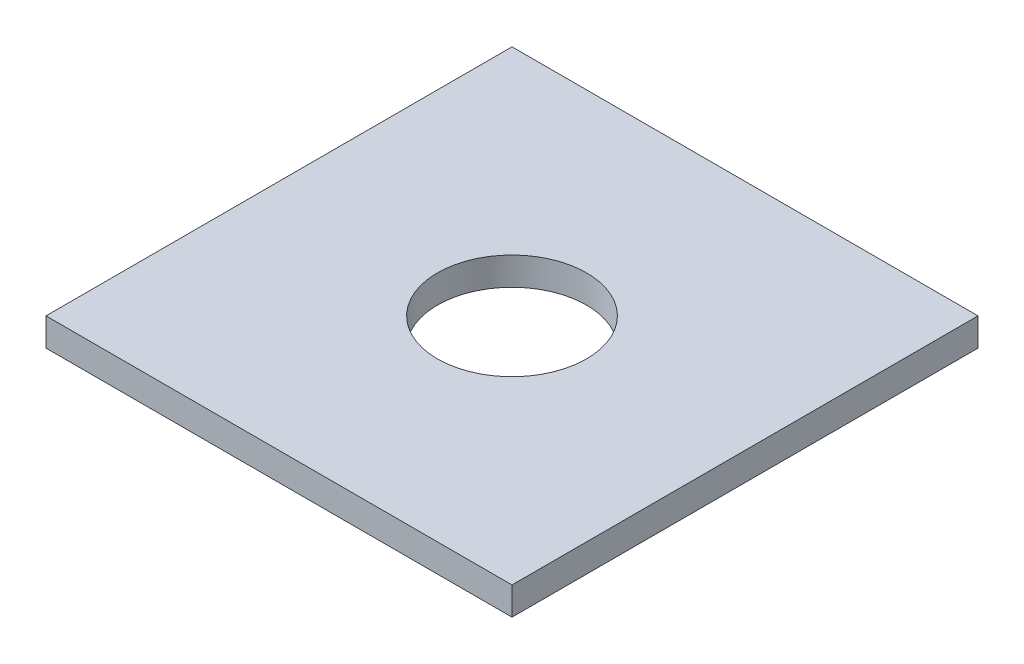
ISO-10303-21;
HEADER;
FILE_DESCRIPTION(('STEP AP214'),'2;1');
FILE_NAME('part.step','',(''),(''),'','','');
FILE_SCHEMA(('AUTOMOTIVE_DESIGN { 1 0 10303 214 1 1 1 1 }'));
ENDSEC;
DATA;
#1=APPLICATION_CONTEXT('core data for automotive mechanical design processes');
#2=APPLICATION_PROTOCOL_DEFINITION('international standard','automotive_design',2000,#1);
#3=PRODUCT_CONTEXT('',#1,'mechanical');
#4=PRODUCT('Part','Part','',(#3));
#5=PRODUCT_RELATED_PRODUCT_CATEGORY('part','',(#4));
#6=PRODUCT_DEFINITION_FORMATION('','',#4);
#7=PRODUCT_DEFINITION_CONTEXT('part definition',#1,'design');
#8=PRODUCT_DEFINITION('design','',#6,#7);
#9=PRODUCT_DEFINITION_SHAPE('','',#8);
#10=(LENGTH_UNIT() NAMED_UNIT(*) SI_UNIT(.MILLI.,.METRE.));
#11=(NAMED_UNIT(*) PLANE_ANGLE_UNIT() SI_UNIT($,.RADIAN.));
#12=(NAMED_UNIT(*) SI_UNIT($,.STERADIAN.) SOLID_ANGLE_UNIT());
#13=UNCERTAINTY_MEASURE_WITH_UNIT(LENGTH_MEASURE(1.E-05),#10,'distance_accuracy_value','');
#14=(GEOMETRIC_REPRESENTATION_CONTEXT(3) GLOBAL_UNCERTAINTY_ASSIGNED_CONTEXT((#13)) GLOBAL_UNIT_ASSIGNED_CONTEXT((#10,
#11,#12)) REPRESENTATION_CONTEXT('',''));
#15=CARTESIAN_POINT('',(0.,0.,0.));
#16=DIRECTION('',(0.,0.,1.));
#17=DIRECTION('',(1.,0.,0.));
#18=AXIS2_PLACEMENT_3D('',#15,#16,#17);
#19=CARTESIAN_POINT('',(0.,3.,0.));
#20=DIRECTION('',(0.,1.,0.));
#21=DIRECTION('',(0.,0.,1.));
#22=AXIS2_PLACEMENT_3D('',#19,#20,#21);
#23=PLANE('',#22);
#24=DIRECTION('',(0.,0.,-1.));
#25=VECTOR('',#24,1.);
#26=CARTESIAN_POINT('',(25.,3.,-25.));
#27=LINE('',#26,#25);
#28=CARTESIAN_POINT('',(25.,3.,25.));
#29=VERTEX_POINT('',#28);
#30=CARTESIAN_POINT('',(25.,3.,-25.));
#31=VERTEX_POINT('',#30);
#32=EDGE_CURVE('E85',#29,#31,#27,.T.);
#33=ORIENTED_EDGE('',*,*,#32,.T.);
#34=DIRECTION('',(-1.,0.,0.));
#35=VECTOR('',#34,1.);
#36=CARTESIAN_POINT('',(-25.,3.,-25.));
#37=LINE('',#36,#35);
#38=CARTESIAN_POINT('',(-25.,3.,-25.));
#39=VERTEX_POINT('',#38);
#40=EDGE_CURVE('E80',#31,#39,#37,.T.);
#41=ORIENTED_EDGE('',*,*,#40,.T.);
#42=DIRECTION('',(0.,0.,1.));
#43=VECTOR('',#42,1.);
#44=CARTESIAN_POINT('',(-25.,3.,-25.));
#45=LINE('',#44,#43);
#46=CARTESIAN_POINT('',(-25.,3.,25.));
#47=VERTEX_POINT('',#46);
#48=EDGE_CURVE('E83',#39,#47,#45,.T.);
#49=ORIENTED_EDGE('',*,*,#48,.T.);
#50=DIRECTION('',(1.,0.,0.));
#51=VECTOR('',#50,1.);
#52=CARTESIAN_POINT('',(-25.,3.,25.));
#53=LINE('',#52,#51);
#54=EDGE_CURVE('E50',#47,#29,#53,.T.);
#55=ORIENTED_EDGE('',*,*,#54,.T.);
#56=EDGE_LOOP('',(#33,#41,#49,#55));
#57=FACE_BOUND('',#56,.T.);
#58=CARTESIAN_POINT('',(0.,3.,0.));
#59=DIRECTION('',(0.,1.,0.));
#60=DIRECTION('',(0.,0.,1.));
#61=AXIS2_PLACEMENT_3D('',#58,#59,#60);
#62=CIRCLE('',#61,8.);
#63=CARTESIAN_POINT('',(0.,3.,8.));
#64=VERTEX_POINT('',#63);
#65=EDGE_CURVE('E100',#64,#64,#62,.T.);
#66=ORIENTED_EDGE('',*,*,#65,.F.);
#67=EDGE_LOOP('',(#66));
#68=FACE_BOUND('',#67,.T.);
#69=ADVANCED_FACE('F33',(#57,#68),#23,.T.);
#70=CARTESIAN_POINT('',(0.,0.,0.));
#71=DIRECTION('',(0.,1.,0.));
#72=DIRECTION('',(0.,0.,1.));
#73=AXIS2_PLACEMENT_3D('',#70,#71,#72);
#74=PLANE('',#73);
#75=DIRECTION('',(0.,0.,-1.));
#76=VECTOR('',#75,1.);
#77=CARTESIAN_POINT('',(25.,0.,-25.));
#78=LINE('',#77,#76);
#79=CARTESIAN_POINT('',(25.,0.,25.));
#80=VERTEX_POINT('',#79);
#81=CARTESIAN_POINT('',(25.,0.,-25.));
#82=VERTEX_POINT('',#81);
#83=EDGE_CURVE('E97',#80,#82,#78,.T.);
#84=ORIENTED_EDGE('',*,*,#83,.F.);
#85=DIRECTION('',(1.,0.,0.));
#86=VECTOR('',#85,1.);
#87=CARTESIAN_POINT('',(-25.,0.,25.));
#88=LINE('',#87,#86);
#89=CARTESIAN_POINT('',(-25.,0.,25.));
#90=VERTEX_POINT('',#89);
#91=EDGE_CURVE('E73',#90,#80,#88,.T.);
#92=ORIENTED_EDGE('',*,*,#91,.F.);
#93=DIRECTION('',(0.,0.,1.));
#94=VECTOR('',#93,1.);
#95=CARTESIAN_POINT('',(-25.,0.,-25.));
#96=LINE('',#95,#94);
#97=CARTESIAN_POINT('',(-25.,0.,-25.));
#98=VERTEX_POINT('',#97);
#99=EDGE_CURVE('E67',#98,#90,#96,.T.);
#100=ORIENTED_EDGE('',*,*,#99,.F.);
#101=DIRECTION('',(-1.,0.,0.));
#102=VECTOR('',#101,1.);
#103=CARTESIAN_POINT('',(-25.,0.,-25.));
#104=LINE('',#103,#102);
#105=EDGE_CURVE('E89',#82,#98,#104,.T.);
#106=ORIENTED_EDGE('',*,*,#105,.F.);
#107=EDGE_LOOP('',(#84,#92,#100,#106));
#108=FACE_BOUND('',#107,.T.);
#109=CARTESIAN_POINT('',(0.,0.,0.));
#110=DIRECTION('',(0.,1.,0.));
#111=DIRECTION('',(0.,0.,1.));
#112=AXIS2_PLACEMENT_3D('',#109,#110,#111);
#113=CIRCLE('',#112,8.);
#114=CARTESIAN_POINT('',(0.,0.,8.));
#115=VERTEX_POINT('',#114);
#116=EDGE_CURVE('E112',#115,#115,#113,.T.);
#117=ORIENTED_EDGE('',*,*,#116,.T.);
#118=EDGE_LOOP('',(#117));
#119=FACE_BOUND('',#118,.T.);
#120=ADVANCED_FACE('F108',(#108,#119),#74,.F.);
#121=CARTESIAN_POINT('',(25.,3.,-25.));
#122=DIRECTION('',(-1.,0.,0.));
#123=DIRECTION('',(0.,0.,1.));
#124=AXIS2_PLACEMENT_3D('',#121,#122,#123);
#125=PLANE('',#124);
#126=ORIENTED_EDGE('',*,*,#83,.T.);
#127=DIRECTION('',(0.,-1.,0.));
#128=VECTOR('',#127,1.);
#129=CARTESIAN_POINT('',(25.,3.,-25.));
#130=LINE('',#129,#128);
#131=EDGE_CURVE('E11',#31,#82,#130,.T.);
#132=ORIENTED_EDGE('',*,*,#131,.F.);
#133=ORIENTED_EDGE('',*,*,#32,.F.);
#134=DIRECTION('',(0.,-1.,0.));
#135=VECTOR('',#134,1.);
#136=CARTESIAN_POINT('',(25.,3.,25.));
#137=LINE('',#136,#135);
#138=EDGE_CURVE('E93',#29,#80,#137,.T.);
#139=ORIENTED_EDGE('',*,*,#138,.T.);
#140=EDGE_LOOP('',(#126,#132,#133,#139));
#141=FACE_BOUND('',#140,.T.);
#142=ADVANCED_FACE('F35',(#141),#125,.F.);
#143=CARTESIAN_POINT('',(-25.,3.,-25.));
#144=DIRECTION('',(0.,0.,1.));
#145=DIRECTION('',(1.,0.,0.));
#146=AXIS2_PLACEMENT_3D('',#143,#144,#145);
#147=PLANE('',#146);
#148=ORIENTED_EDGE('',*,*,#105,.T.);
#149=DIRECTION('',(0.,-1.,0.));
#150=VECTOR('',#149,1.);
#151=CARTESIAN_POINT('',(-25.,3.,-25.));
#152=LINE('',#151,#150);
#153=EDGE_CURVE('E42',#39,#98,#152,.T.);
#154=ORIENTED_EDGE('',*,*,#153,.F.);
#155=ORIENTED_EDGE('',*,*,#40,.F.);
#156=ORIENTED_EDGE('',*,*,#131,.T.);
#157=EDGE_LOOP('',(#148,#154,#155,#156));
#158=FACE_BOUND('',#157,.T.);
#159=ADVANCED_FACE('F88',(#158),#147,.F.);
#160=CARTESIAN_POINT('',(-25.,3.,-25.));
#161=DIRECTION('',(1.,0.,0.));
#162=DIRECTION('',(0.,0.,-1.));
#163=AXIS2_PLACEMENT_3D('',#160,#161,#162);
#164=PLANE('',#163);
#165=ORIENTED_EDGE('',*,*,#99,.T.);
#166=DIRECTION('',(0.,-1.,0.));
#167=VECTOR('',#166,1.);
#168=CARTESIAN_POINT('',(-25.,3.,25.));
#169=LINE('',#168,#167);
#170=EDGE_CURVE('E90',#47,#90,#169,.T.);
#171=ORIENTED_EDGE('',*,*,#170,.F.);
#172=ORIENTED_EDGE('',*,*,#48,.F.);
#173=ORIENTED_EDGE('',*,*,#153,.T.);
#174=EDGE_LOOP('',(#165,#171,#172,#173));
#175=FACE_BOUND('',#174,.T.);
#176=ADVANCED_FACE('F91',(#175),#164,.F.);
#177=CARTESIAN_POINT('',(-25.,3.,25.));
#178=DIRECTION('',(0.,0.,-1.));
#179=DIRECTION('',(-1.,0.,0.));
#180=AXIS2_PLACEMENT_3D('',#177,#178,#179);
#181=PLANE('',#180);
#182=ORIENTED_EDGE('',*,*,#91,.T.);
#183=ORIENTED_EDGE('',*,*,#138,.F.);
#184=ORIENTED_EDGE('',*,*,#54,.F.);
#185=ORIENTED_EDGE('',*,*,#170,.T.);
#186=EDGE_LOOP('',(#182,#183,#184,#185));
#187=FACE_BOUND('',#186,.T.);
#188=ADVANCED_FACE('F105',(#187),#181,.F.);
#189=CARTESIAN_POINT('',(0.,3.,0.));
#190=DIRECTION('',(0.,-1.,0.));
#191=DIRECTION('',(0.,0.,-1.));
#192=AXIS2_PLACEMENT_3D('',#189,#190,#191);
#193=CYLINDRICAL_SURFACE('',#192,8.);
#194=ORIENTED_EDGE('',*,*,#65,.T.);
#195=EDGE_LOOP('',(#194));
#196=FACE_BOUND('',#195,.T.);
#197=ORIENTED_EDGE('',*,*,#116,.F.);
#198=EDGE_LOOP('',(#197));
#199=FACE_BOUND('',#198,.T.);
#200=ADVANCED_FACE('F118',(#196,#199),#193,.F.);
#201=CLOSED_SHELL('',(#69,#120,#142,#159,#176,#188,#200));
#202=MANIFOLD_SOLID_BREP('B2',#201);
#203=ADVANCED_BREP_SHAPE_REPRESENTATION('',(#18,#202),#14);
#204=SHAPE_DEFINITION_REPRESENTATION(#9,#203);
ENDSEC;
END-ISO-10303-21;
